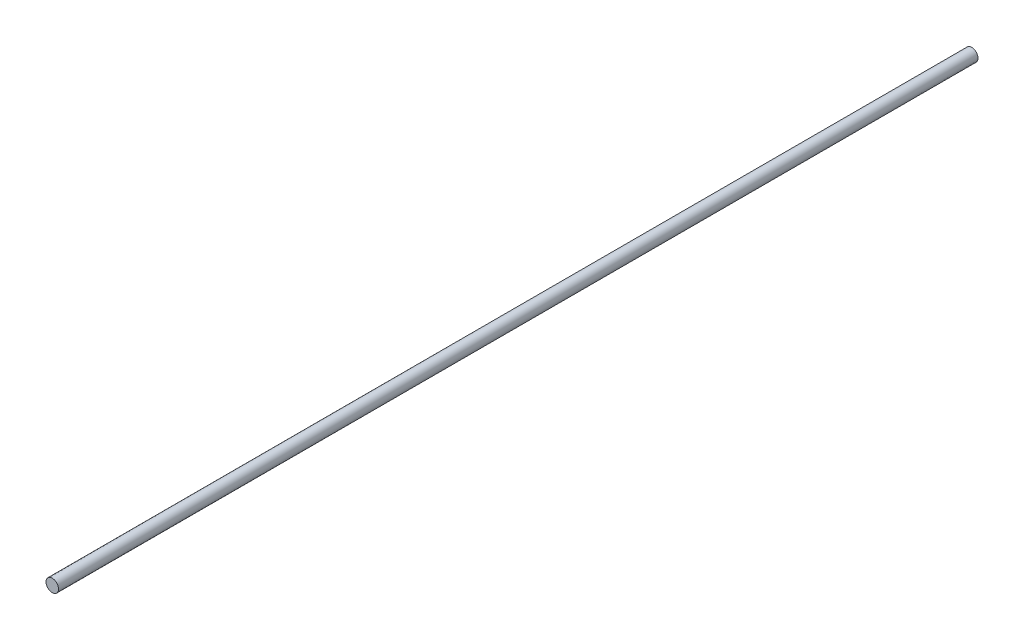
ISO-10303-21;
HEADER;
FILE_DESCRIPTION(('STEP AP214'),'2;1');
FILE_NAME('part.step','',(''),(''),'','','');
FILE_SCHEMA(('AUTOMOTIVE_DESIGN { 1 0 10303 214 1 1 1 1 }'));
ENDSEC;
DATA;
#1=APPLICATION_CONTEXT('core data for automotive mechanical design processes');
#2=APPLICATION_PROTOCOL_DEFINITION('international standard','automotive_design',2000,#1);
#3=PRODUCT_CONTEXT('',#1,'mechanical');
#4=PRODUCT('Part','Part','',(#3));
#5=PRODUCT_RELATED_PRODUCT_CATEGORY('part','',(#4));
#6=PRODUCT_DEFINITION_FORMATION('','',#4);
#7=PRODUCT_DEFINITION_CONTEXT('part definition',#1,'design');
#8=PRODUCT_DEFINITION('design','',#6,#7);
#9=PRODUCT_DEFINITION_SHAPE('','',#8);
#10=(LENGTH_UNIT() NAMED_UNIT(*) SI_UNIT(.MILLI.,.METRE.));
#11=(NAMED_UNIT(*) PLANE_ANGLE_UNIT() SI_UNIT($,.RADIAN.));
#12=(NAMED_UNIT(*) SI_UNIT($,.STERADIAN.) SOLID_ANGLE_UNIT());
#13=UNCERTAINTY_MEASURE_WITH_UNIT(LENGTH_MEASURE(1.E-05),#10,'distance_accuracy_value','');
#14=(GEOMETRIC_REPRESENTATION_CONTEXT(3) GLOBAL_UNCERTAINTY_ASSIGNED_CONTEXT((#13)) GLOBAL_UNIT_ASSIGNED_CONTEXT((#10,
#11,#12)) REPRESENTATION_CONTEXT('',''));
#15=CARTESIAN_POINT('',(0.,0.,0.));
#16=DIRECTION('',(0.,0.,1.));
#17=DIRECTION('',(1.,0.,0.));
#18=AXIS2_PLACEMENT_3D('',#15,#16,#17);
#19=CARTESIAN_POINT('',(0.,0.,440.));
#20=DIRECTION('',(0.,0.,-1.));
#21=DIRECTION('',(-1.,0.,0.));
#22=AXIS2_PLACEMENT_3D('',#19,#20,#21);
#23=CYLINDRICAL_SURFACE('',#22,3.);
#24=CARTESIAN_POINT('',(0.,0.,440.));
#25=DIRECTION('',(0.,0.,1.));
#26=DIRECTION('',(1.,0.,0.));
#27=AXIS2_PLACEMENT_3D('',#24,#25,#26);
#28=CIRCLE('',#27,3.);
#29=CARTESIAN_POINT('',(3.,0.,440.));
#30=VERTEX_POINT('',#29);
#31=EDGE_CURVE('E10',#30,#30,#28,.T.);
#32=ORIENTED_EDGE('',*,*,#31,.F.);
#33=EDGE_LOOP('',(#32));
#34=FACE_BOUND('',#33,.T.);
#35=CARTESIAN_POINT('',(0.,0.,0.));
#36=DIRECTION('',(0.,0.,1.));
#37=DIRECTION('',(1.,0.,0.));
#38=AXIS2_PLACEMENT_3D('',#35,#36,#37);
#39=CIRCLE('',#38,3.);
#40=CARTESIAN_POINT('',(3.,0.,0.));
#41=VERTEX_POINT('',#40);
#42=EDGE_CURVE('E33',#41,#41,#39,.T.);
#43=ORIENTED_EDGE('',*,*,#42,.T.);
#44=EDGE_LOOP('',(#43));
#45=FACE_BOUND('',#44,.T.);
#46=ADVANCED_FACE('F30',(#34,#45),#23,.T.);
#47=CARTESIAN_POINT('',(0.,0.,440.));
#48=DIRECTION('',(0.,0.,1.));
#49=DIRECTION('',(1.,0.,0.));
#50=AXIS2_PLACEMENT_3D('',#47,#48,#49);
#51=PLANE('',#50);
#52=ORIENTED_EDGE('',*,*,#31,.T.);
#53=EDGE_LOOP('',(#52));
#54=FACE_BOUND('',#53,.T.);
#55=ADVANCED_FACE('F45',(#54),#51,.T.);
#56=CARTESIAN_POINT('',(0.,0.,0.));
#57=DIRECTION('',(0.,0.,1.));
#58=DIRECTION('',(1.,0.,0.));
#59=AXIS2_PLACEMENT_3D('',#56,#57,#58);
#60=PLANE('',#59);
#61=ORIENTED_EDGE('',*,*,#42,.F.);
#62=EDGE_LOOP('',(#61));
#63=FACE_BOUND('',#62,.T.);
#64=ADVANCED_FACE('F43',(#63),#60,.F.);
#65=CLOSED_SHELL('',(#46,#55,#64));
#66=MANIFOLD_SOLID_BREP('B2',#65);
#67=ADVANCED_BREP_SHAPE_REPRESENTATION('',(#18,#66),#14);
#68=SHAPE_DEFINITION_REPRESENTATION(#9,#67);
ENDSEC;
END-ISO-10303-21;
